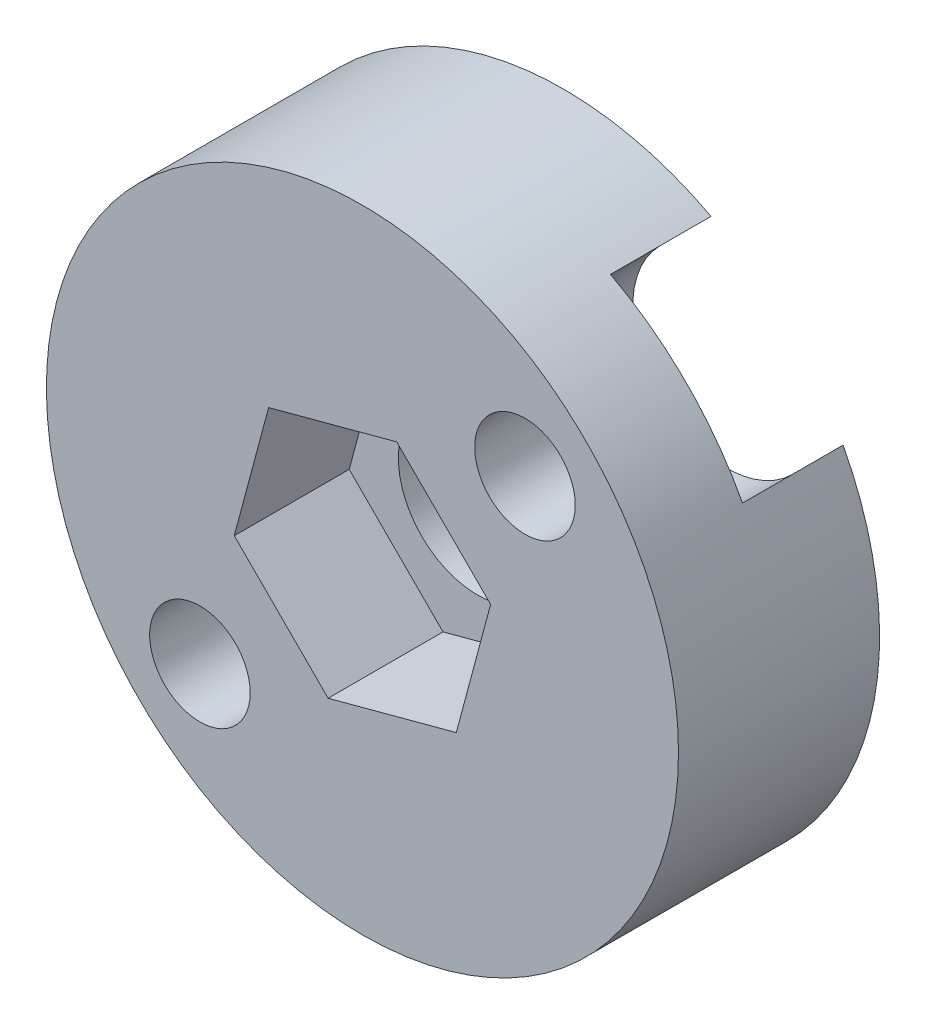
ISO-10303-21;
HEADER;
FILE_DESCRIPTION(('STEP AP214'),'2;1');
FILE_NAME('part.step','',(''),(''),'','','');
FILE_SCHEMA(('AUTOMOTIVE_DESIGN { 1 0 10303 214 1 1 1 1 }'));
ENDSEC;
DATA;
#1=APPLICATION_CONTEXT('core data for automotive mechanical design processes');
#2=APPLICATION_PROTOCOL_DEFINITION('international standard','automotive_design',2000,#1);
#3=PRODUCT_CONTEXT('',#1,'mechanical');
#4=PRODUCT('Part','Part','',(#3));
#5=PRODUCT_RELATED_PRODUCT_CATEGORY('part','',(#4));
#6=PRODUCT_DEFINITION_FORMATION('','',#4);
#7=PRODUCT_DEFINITION_CONTEXT('part definition',#1,'design');
#8=PRODUCT_DEFINITION('design','',#6,#7);
#9=PRODUCT_DEFINITION_SHAPE('','',#8);
#10=(LENGTH_UNIT() NAMED_UNIT(*) SI_UNIT(.MILLI.,.METRE.));
#11=(NAMED_UNIT(*) PLANE_ANGLE_UNIT() SI_UNIT($,.RADIAN.));
#12=(NAMED_UNIT(*) SI_UNIT($,.STERADIAN.) SOLID_ANGLE_UNIT());
#13=UNCERTAINTY_MEASURE_WITH_UNIT(LENGTH_MEASURE(1.E-05),#10,'distance_accuracy_value','');
#14=(GEOMETRIC_REPRESENTATION_CONTEXT(3) GLOBAL_UNCERTAINTY_ASSIGNED_CONTEXT((#13)) GLOBAL_UNIT_ASSIGNED_CONTEXT((#10,
#11,#12)) REPRESENTATION_CONTEXT('',''));
#15=CARTESIAN_POINT('',(0.,0.,0.));
#16=DIRECTION('',(0.,0.,1.));
#17=DIRECTION('',(1.,0.,0.));
#18=AXIS2_PLACEMENT_3D('',#15,#16,#17);
#19=CARTESIAN_POINT('',(0.,0.,7.));
#20=DIRECTION('',(0.,0.,-1.));
#21=DIRECTION('',(-1.,0.,0.));
#22=AXIS2_PLACEMENT_3D('',#19,#20,#21);
#23=CYLINDRICAL_SURFACE('',#22,2.75);
#24=CARTESIAN_POINT('',(0.,0.,0.));
#25=DIRECTION('',(0.,0.,1.));
#26=DIRECTION('',(1.,0.,0.));
#27=AXIS2_PLACEMENT_3D('',#24,#25,#26);
#28=CIRCLE('',#27,2.75);
#29=CARTESIAN_POINT('',(2.75,0.,0.));
#30=VERTEX_POINT('',#29);
#31=EDGE_CURVE('E244',#30,#30,#28,.T.);
#32=ORIENTED_EDGE('',*,*,#31,.F.);
#33=EDGE_LOOP('',(#32));
#34=FACE_BOUND('',#33,.T.);
#35=CARTESIAN_POINT('',(0.,0.,3.));
#36=DIRECTION('',(0.,0.,1.));
#37=DIRECTION('',(1.,0.,0.));
#38=AXIS2_PLACEMENT_3D('',#35,#36,#37);
#39=CIRCLE('',#38,2.75);
#40=CARTESIAN_POINT('',(2.75,0.,3.));
#41=VERTEX_POINT('',#40);
#42=EDGE_CURVE('E38',#41,#41,#39,.T.);
#43=ORIENTED_EDGE('',*,*,#42,.T.);
#44=EDGE_LOOP('',(#43));
#45=FACE_BOUND('',#44,.T.);
#46=ADVANCED_FACE('F34',(#34,#45),#23,.F.);
#47=CARTESIAN_POINT('',(0.,0.,7.));
#48=DIRECTION('',(0.,0.,1.));
#49=DIRECTION('',(1.,0.,0.));
#50=AXIS2_PLACEMENT_3D('',#47,#48,#49);
#51=PLANE('',#50);
#52=DIRECTION('',(0.707106781186547,-0.707106781186548,0.));
#53=VECTOR('',#52,1.);
#54=CARTESIAN_POINT('',(-4.46142028660164,-1.19543396289074,7.));
#55=LINE('',#54,#53);
#56=CARTESIAN_POINT('',(-4.46142028660164,-1.19543396289074,7.));
#57=VERTEX_POINT('',#56);
#58=CARTESIAN_POINT('',(-1.19543396289074,-4.46142028660164,7.));
#59=VERTEX_POINT('',#58);
#60=EDGE_CURVE('E196',#57,#59,#55,.T.);
#61=ORIENTED_EDGE('',*,*,#60,.F.);
#62=DIRECTION('',(-0.258819045102521,-0.965925826289068,0.));
#63=VECTOR('',#62,1.);
#64=CARTESIAN_POINT('',(-3.2659863237109,3.26598632371091,7.));
#65=LINE('',#64,#63);
#66=CARTESIAN_POINT('',(-3.2659863237109,3.26598632371091,7.));
#67=VERTEX_POINT('',#66);
#68=EDGE_CURVE('E201',#67,#57,#65,.T.);
#69=ORIENTED_EDGE('',*,*,#68,.F.);
#70=DIRECTION('',(-0.965925826289068,-0.258819045102521,0.));
#71=VECTOR('',#70,1.);
#72=CARTESIAN_POINT('',(1.19543396289074,4.46142028660164,7.));
#73=LINE('',#72,#71);
#74=CARTESIAN_POINT('',(1.19543396289074,4.46142028660164,7.));
#75=VERTEX_POINT('',#74);
#76=EDGE_CURVE('E227',#75,#67,#73,.T.);
#77=ORIENTED_EDGE('',*,*,#76,.F.);
#78=DIRECTION('',(-0.707106781186547,0.707106781186547,0.));
#79=VECTOR('',#78,1.);
#80=CARTESIAN_POINT('',(4.46142028660164,1.19543396289074,7.));
#81=LINE('',#80,#79);
#82=CARTESIAN_POINT('',(4.46142028660164,1.19543396289074,7.));
#83=VERTEX_POINT('',#82);
#84=EDGE_CURVE('E224',#83,#75,#81,.T.);
#85=ORIENTED_EDGE('',*,*,#84,.F.);
#86=DIRECTION('',(0.25881904510252,0.965925826289068,0.));
#87=VECTOR('',#86,1.);
#88=CARTESIAN_POINT('',(3.2659863237109,-3.26598632371091,7.));
#89=LINE('',#88,#87);
#90=CARTESIAN_POINT('',(3.2659863237109,-3.26598632371091,7.));
#91=VERTEX_POINT('',#90);
#92=EDGE_CURVE('E221',#91,#83,#89,.T.);
#93=ORIENTED_EDGE('',*,*,#92,.F.);
#94=DIRECTION('',(0.965925826289068,0.258819045102521,0.));
#95=VECTOR('',#94,1.);
#96=CARTESIAN_POINT('',(-1.19543396289074,-4.46142028660164,7.));
#97=LINE('',#96,#95);
#98=EDGE_CURVE('E218',#59,#91,#97,.T.);
#99=ORIENTED_EDGE('',*,*,#98,.F.);
#100=EDGE_LOOP('',(#61,#69,#77,#85,#93,#99));
#101=FACE_BOUND('',#100,.T.);
#102=CARTESIAN_POINT('',(-5.65685424949238,-5.65685424949238,7.));
#103=DIRECTION('',(0.,0.,1.));
#104=DIRECTION('',(1.,0.,0.));
#105=AXIS2_PLACEMENT_3D('',#102,#103,#104);
#106=CIRCLE('',#105,1.75);
#107=CARTESIAN_POINT('',(-3.90685424949238,-5.65685424949238,7.));
#108=VERTEX_POINT('',#107);
#109=EDGE_CURVE('E247',#108,#108,#106,.T.);
#110=ORIENTED_EDGE('',*,*,#109,.F.);
#111=EDGE_LOOP('',(#110));
#112=FACE_BOUND('',#111,.T.);
#113=CARTESIAN_POINT('',(0.,0.,7.));
#114=DIRECTION('',(0.,0.,1.));
#115=DIRECTION('',(1.,0.,0.));
#116=AXIS2_PLACEMENT_3D('',#113,#114,#115);
#117=CIRCLE('',#116,11.);
#118=CARTESIAN_POINT('',(11.,0.,7.));
#119=VERTEX_POINT('',#118);
#120=EDGE_CURVE('E12',#119,#119,#117,.T.);
#121=ORIENTED_EDGE('',*,*,#120,.T.);
#122=EDGE_LOOP('',(#121));
#123=FACE_BOUND('',#122,.T.);
#124=CARTESIAN_POINT('',(5.65685424949238,5.65685424949238,7.));
#125=DIRECTION('',(0.,0.,1.));
#126=DIRECTION('',(1.,0.,0.));
#127=AXIS2_PLACEMENT_3D('',#124,#125,#126);
#128=CIRCLE('',#127,1.75);
#129=CARTESIAN_POINT('',(7.40685424949238,5.65685424949238,7.));
#130=VERTEX_POINT('',#129);
#131=EDGE_CURVE('E250',#130,#130,#128,.T.);
#132=ORIENTED_EDGE('',*,*,#131,.F.);
#133=EDGE_LOOP('',(#132));
#134=FACE_BOUND('',#133,.T.);
#135=ADVANCED_FACE('F295',(#101,#112,#123,#134),#51,.T.);
#136=CARTESIAN_POINT('',(0.,0.,0.));
#137=DIRECTION('',(0.,0.,1.));
#138=DIRECTION('',(1.,0.,0.));
#139=AXIS2_PLACEMENT_3D('',#136,#137,#138);
#140=PLANE('',#139);
#141=CARTESIAN_POINT('',(0.,0.,0.));
#142=DIRECTION('',(0.,0.,1.));
#143=DIRECTION('',(1.,0.,0.));
#144=AXIS2_PLACEMENT_3D('',#141,#142,#143);
#145=CIRCLE('',#144,11.);
#146=CARTESIAN_POINT('',(-5.13283493499465,-9.72902901270721,0.));
#147=VERTEX_POINT('',#146);
#148=CARTESIAN_POINT('',(9.7290290127072,5.13283493499465,0.));
#149=VERTEX_POINT('',#148);
#150=EDGE_CURVE('E252',#147,#149,#145,.T.);
#151=ORIENTED_EDGE('',*,*,#150,.F.);
#152=DIRECTION('',(-0.707106781186548,-0.707106781186548,0.));
#153=VECTOR('',#152,1.);
#154=CARTESIAN_POINT('',(2.29809703885628,-2.29809703885628,0.));
#155=LINE('',#154,#153);
#156=CARTESIAN_POINT('',(-3.3587572106361,-7.95495128834866,0.));
#157=VERTEX_POINT('',#156);
#158=EDGE_CURVE('E160',#157,#147,#155,.T.);
#159=ORIENTED_EDGE('',*,*,#158,.F.);
#160=CARTESIAN_POINT('',(-5.65685424949238,-5.65685424949238,0.));
#161=DIRECTION('',(0.,0.,-1.));
#162=DIRECTION('',(1.,0.,0.));
#163=AXIS2_PLACEMENT_3D('',#160,#161,#162);
#164=CIRCLE('',#163,3.25);
#165=CARTESIAN_POINT('',(-7.95495128834866,-3.3587572106361,0.));
#166=VERTEX_POINT('',#165);
#167=EDGE_CURVE('E164',#166,#157,#164,.T.);
#168=ORIENTED_EDGE('',*,*,#167,.F.);
#169=DIRECTION('',(-0.707106781186547,-0.707106781186548,0.));
#170=VECTOR('',#169,1.);
#171=CARTESIAN_POINT('',(-2.29809703885628,2.29809703885628,0.));
#172=LINE('',#171,#170);
#173=CARTESIAN_POINT('',(-9.7290290127072,-5.13283493499465,0.));
#174=VERTEX_POINT('',#173);
#175=EDGE_CURVE('E158',#166,#174,#172,.T.);
#176=ORIENTED_EDGE('',*,*,#175,.T.);
#177=CARTESIAN_POINT('',(5.13283493499465,9.72902901270721,0.));
#178=VERTEX_POINT('',#177);
#179=EDGE_CURVE('E43',#178,#174,#145,.T.);
#180=ORIENTED_EDGE('',*,*,#179,.F.);
#181=DIRECTION('',(0.707106781186548,0.707106781186548,0.));
#182=VECTOR('',#181,1.);
#183=CARTESIAN_POINT('',(-2.29809703885628,2.29809703885628,0.));
#184=LINE('',#183,#182);
#185=CARTESIAN_POINT('',(3.3587572106361,7.95495128834866,0.));
#186=VERTEX_POINT('',#185);
#187=EDGE_CURVE('E182',#186,#178,#184,.T.);
#188=ORIENTED_EDGE('',*,*,#187,.F.);
#189=CARTESIAN_POINT('',(5.65685424949238,5.65685424949238,0.));
#190=DIRECTION('',(0.,0.,-1.));
#191=DIRECTION('',(-1.,0.,0.));
#192=AXIS2_PLACEMENT_3D('',#189,#190,#191);
#193=CIRCLE('',#192,3.25);
#194=CARTESIAN_POINT('',(7.95495128834866,3.3587572106361,0.));
#195=VERTEX_POINT('',#194);
#196=EDGE_CURVE('E179',#195,#186,#193,.T.);
#197=ORIENTED_EDGE('',*,*,#196,.F.);
#198=DIRECTION('',(0.707106781186547,0.707106781186548,0.));
#199=VECTOR('',#198,1.);
#200=CARTESIAN_POINT('',(2.29809703885628,-2.29809703885628,0.));
#201=LINE('',#200,#199);
#202=EDGE_CURVE('E176',#195,#149,#201,.T.);
#203=ORIENTED_EDGE('',*,*,#202,.T.);
#204=EDGE_LOOP('',(#151,#159,#168,#176,#180,#188,#197,#203));
#205=FACE_BOUND('',#204,.T.);
#206=ORIENTED_EDGE('',*,*,#31,.T.);
#207=EDGE_LOOP('',(#206));
#208=FACE_BOUND('',#207,.T.);
#209=ADVANCED_FACE('F269',(#205,#208),#140,.F.);
#210=CARTESIAN_POINT('',(0.,0.,7.));
#211=DIRECTION('',(0.,0.,-1.));
#212=DIRECTION('',(-1.,0.,0.));
#213=AXIS2_PLACEMENT_3D('',#210,#211,#212);
#214=CYLINDRICAL_SURFACE('',#213,11.);
#215=CARTESIAN_POINT('',(0.,0.,3.5));
#216=DIRECTION('',(0.,0.,1.));
#217=DIRECTION('',(1.,0.,0.));
#218=AXIS2_PLACEMENT_3D('',#215,#216,#217);
#219=CIRCLE('',#218,11.);
#220=CARTESIAN_POINT('',(-5.13283493499464,-9.7290290127072,3.5));
#221=VERTEX_POINT('',#220);
#222=CARTESIAN_POINT('',(-9.7290290127072,-5.13283493499465,3.5));
#223=VERTEX_POINT('',#222);
#224=EDGE_CURVE('E151',#221,#223,#219,.F.);
#225=ORIENTED_EDGE('',*,*,#224,.F.);
#226=DIRECTION('',(0.,0.,-1.));
#227=VECTOR('',#226,1.);
#228=CARTESIAN_POINT('',(-5.13283493499465,-9.72902901270721,17.3551188562044));
#229=LINE('',#228,#227);
#230=EDGE_CURVE('E162',#221,#147,#229,.T.);
#231=ORIENTED_EDGE('',*,*,#230,.T.);
#232=ORIENTED_EDGE('',*,*,#150,.T.);
#233=DIRECTION('',(0.,0.,-1.));
#234=VECTOR('',#233,1.);
#235=CARTESIAN_POINT('',(9.7290290127072,5.13283493499465,17.3551188562044));
#236=LINE('',#235,#234);
#237=CARTESIAN_POINT('',(9.7290290127072,5.13283493499465,3.5));
#238=VERTEX_POINT('',#237);
#239=EDGE_CURVE('E185',#238,#149,#236,.T.);
#240=ORIENTED_EDGE('',*,*,#239,.F.);
#241=CARTESIAN_POINT('',(0.,0.,3.5));
#242=DIRECTION('',(0.,0.,1.));
#243=DIRECTION('',(1.,0.,0.));
#244=AXIS2_PLACEMENT_3D('',#241,#242,#243);
#245=CIRCLE('',#244,11.);
#246=CARTESIAN_POINT('',(5.13283493499464,9.7290290127072,3.5));
#247=VERTEX_POINT('',#246);
#248=EDGE_CURVE('E169',#247,#238,#245,.F.);
#249=ORIENTED_EDGE('',*,*,#248,.F.);
#250=DIRECTION('',(0.,0.,-1.));
#251=VECTOR('',#250,1.);
#252=CARTESIAN_POINT('',(5.13283493499465,9.72902901270721,17.3551188562044));
#253=LINE('',#252,#251);
#254=EDGE_CURVE('E189',#247,#178,#253,.T.);
#255=ORIENTED_EDGE('',*,*,#254,.T.);
#256=ORIENTED_EDGE('',*,*,#179,.T.);
#257=DIRECTION('',(0.,0.,-1.));
#258=VECTOR('',#257,1.);
#259=CARTESIAN_POINT('',(-9.7290290127072,-5.13283493499465,17.3551188562044));
#260=LINE('',#259,#258);
#261=EDGE_CURVE('E146',#223,#174,#260,.T.);
#262=ORIENTED_EDGE('',*,*,#261,.F.);
#263=EDGE_LOOP('',(#225,#231,#232,#240,#249,#255,#256,#262));
#264=FACE_BOUND('',#263,.T.);
#265=ORIENTED_EDGE('',*,*,#120,.F.);
#266=EDGE_LOOP('',(#265));
#267=FACE_BOUND('',#266,.T.);
#268=ADVANCED_FACE('F36',(#264,#267),#214,.T.);
#269=CARTESIAN_POINT('',(5.65685424949238,5.65685424949238,7.));
#270=DIRECTION('',(0.,0.,-1.));
#271=DIRECTION('',(-1.,0.,0.));
#272=AXIS2_PLACEMENT_3D('',#269,#270,#271);
#273=CYLINDRICAL_SURFACE('',#272,1.75);
#274=CARTESIAN_POINT('',(5.65685424949238,5.65685424949238,3.5));
#275=DIRECTION('',(0.,0.,1.));
#276=DIRECTION('',(1.,0.,0.));
#277=AXIS2_PLACEMENT_3D('',#274,#275,#276);
#278=CIRCLE('',#277,1.75);
#279=CARTESIAN_POINT('',(7.40685424949238,5.65685424949238,3.5));
#280=VERTEX_POINT('',#279);
#281=EDGE_CURVE('E173',#280,#280,#278,.T.);
#282=ORIENTED_EDGE('',*,*,#281,.F.);
#283=EDGE_LOOP('',(#282));
#284=FACE_BOUND('',#283,.T.);
#285=ORIENTED_EDGE('',*,*,#131,.T.);
#286=EDGE_LOOP('',(#285));
#287=FACE_BOUND('',#286,.T.);
#288=ADVANCED_FACE('F291',(#284,#287),#273,.F.);
#289=CARTESIAN_POINT('',(-5.65685424949238,-5.65685424949238,7.));
#290=DIRECTION('',(0.,0.,-1.));
#291=DIRECTION('',(-1.,0.,0.));
#292=AXIS2_PLACEMENT_3D('',#289,#290,#291);
#293=CYLINDRICAL_SURFACE('',#292,1.75);
#294=CARTESIAN_POINT('',(-5.65685424949238,-5.65685424949238,3.5));
#295=DIRECTION('',(0.,0.,1.));
#296=DIRECTION('',(1.,0.,0.));
#297=AXIS2_PLACEMENT_3D('',#294,#295,#296);
#298=CIRCLE('',#297,1.75);
#299=CARTESIAN_POINT('',(-3.90685424949238,-5.65685424949238,3.5));
#300=VERTEX_POINT('',#299);
#301=EDGE_CURVE('E154',#300,#300,#298,.T.);
#302=ORIENTED_EDGE('',*,*,#301,.F.);
#303=EDGE_LOOP('',(#302));
#304=FACE_BOUND('',#303,.T.);
#305=ORIENTED_EDGE('',*,*,#109,.T.);
#306=EDGE_LOOP('',(#305));
#307=FACE_BOUND('',#306,.T.);
#308=ADVANCED_FACE('F287',(#304,#307),#293,.F.);
#309=CARTESIAN_POINT('',(-4.46142028660164,-1.19543396289074,3.));
#310=DIRECTION('',(-0.707106781186548,-0.707106781186547,0.));
#311=DIRECTION('',(0.707106781186547,-0.707106781186548,0.));
#312=AXIS2_PLACEMENT_3D('',#309,#310,#311);
#313=PLANE('',#312);
#314=ORIENTED_EDGE('',*,*,#60,.T.);
#315=DIRECTION('',(0.,0.,1.));
#316=VECTOR('',#315,1.);
#317=CARTESIAN_POINT('',(-1.19543396289074,-4.46142028660164,3.));
#318=LINE('',#317,#316);
#319=CARTESIAN_POINT('',(-1.19543396289074,-4.46142028660164,3.));
#320=VERTEX_POINT('',#319);
#321=EDGE_CURVE('E216',#320,#59,#318,.T.);
#322=ORIENTED_EDGE('',*,*,#321,.F.);
#323=DIRECTION('',(0.707106781186547,-0.707106781186548,0.));
#324=VECTOR('',#323,1.);
#325=CARTESIAN_POINT('',(-4.46142028660164,-1.19543396289074,3.));
#326=LINE('',#325,#324);
#327=CARTESIAN_POINT('',(-4.46142028660164,-1.19543396289074,3.));
#328=VERTEX_POINT('',#327);
#329=EDGE_CURVE('E197',#328,#320,#326,.T.);
#330=ORIENTED_EDGE('',*,*,#329,.F.);
#331=DIRECTION('',(0.,0.,1.));
#332=VECTOR('',#331,1.);
#333=CARTESIAN_POINT('',(-4.46142028660164,-1.19543396289074,3.));
#334=LINE('',#333,#332);
#335=EDGE_CURVE('E232',#328,#57,#334,.T.);
#336=ORIENTED_EDGE('',*,*,#335,.T.);
#337=EDGE_LOOP('',(#314,#322,#330,#336));
#338=FACE_BOUND('',#337,.T.);
#339=ADVANCED_FACE('F290',(#338),#313,.F.);
#340=CARTESIAN_POINT('',(-3.2659863237109,3.26598632371091,3.));
#341=DIRECTION('',(-0.965925826289068,0.258819045102521,0.));
#342=DIRECTION('',(-0.258819045102521,-0.965925826289068,0.));
#343=AXIS2_PLACEMENT_3D('',#340,#341,#342);
#344=PLANE('',#343);
#345=ORIENTED_EDGE('',*,*,#68,.T.);
#346=ORIENTED_EDGE('',*,*,#335,.F.);
#347=DIRECTION('',(-0.258819045102521,-0.965925826289068,0.));
#348=VECTOR('',#347,1.);
#349=CARTESIAN_POINT('',(-3.2659863237109,3.26598632371091,3.));
#350=LINE('',#349,#348);
#351=CARTESIAN_POINT('',(-3.2659863237109,3.26598632371091,3.));
#352=VERTEX_POINT('',#351);
#353=EDGE_CURVE('E213',#352,#328,#350,.T.);
#354=ORIENTED_EDGE('',*,*,#353,.F.);
#355=DIRECTION('',(0.,0.,1.));
#356=VECTOR('',#355,1.);
#357=CARTESIAN_POINT('',(-3.2659863237109,3.26598632371091,3.));
#358=LINE('',#357,#356);
#359=EDGE_CURVE('E234',#352,#67,#358,.T.);
#360=ORIENTED_EDGE('',*,*,#359,.T.);
#361=EDGE_LOOP('',(#345,#346,#354,#360));
#362=FACE_BOUND('',#361,.T.);
#363=ADVANCED_FACE('F321',(#362),#344,.F.);
#364=CARTESIAN_POINT('',(1.19543396289074,4.46142028660164,3.));
#365=DIRECTION('',(-0.258819045102521,0.965925826289068,0.));
#366=DIRECTION('',(-0.965925826289068,-0.258819045102521,0.));
#367=AXIS2_PLACEMENT_3D('',#364,#365,#366);
#368=PLANE('',#367);
#369=ORIENTED_EDGE('',*,*,#76,.T.);
#370=ORIENTED_EDGE('',*,*,#359,.F.);
#371=DIRECTION('',(-0.965925826289068,-0.258819045102521,0.));
#372=VECTOR('',#371,1.);
#373=CARTESIAN_POINT('',(1.19543396289074,4.46142028660164,3.));
#374=LINE('',#373,#372);
#375=CARTESIAN_POINT('',(1.19543396289074,4.46142028660164,3.));
#376=VERTEX_POINT('',#375);
#377=EDGE_CURVE('E210',#376,#352,#374,.T.);
#378=ORIENTED_EDGE('',*,*,#377,.F.);
#379=DIRECTION('',(0.,0.,1.));
#380=VECTOR('',#379,1.);
#381=CARTESIAN_POINT('',(1.19543396289074,4.46142028660164,3.));
#382=LINE('',#381,#380);
#383=EDGE_CURVE('E236',#376,#75,#382,.T.);
#384=ORIENTED_EDGE('',*,*,#383,.T.);
#385=EDGE_LOOP('',(#369,#370,#378,#384));
#386=FACE_BOUND('',#385,.T.);
#387=ADVANCED_FACE('F335',(#386),#368,.F.);
#388=CARTESIAN_POINT('',(4.46142028660164,1.19543396289074,3.));
#389=DIRECTION('',(0.707106781186547,0.707106781186547,0.));
#390=DIRECTION('',(-0.707106781186548,0.707106781186548,0.));
#391=AXIS2_PLACEMENT_3D('',#388,#389,#390);
#392=PLANE('',#391);
#393=ORIENTED_EDGE('',*,*,#84,.T.);
#394=ORIENTED_EDGE('',*,*,#383,.F.);
#395=DIRECTION('',(-0.707106781186547,0.707106781186547,0.));
#396=VECTOR('',#395,1.);
#397=CARTESIAN_POINT('',(4.46142028660164,1.19543396289074,3.));
#398=LINE('',#397,#396);
#399=CARTESIAN_POINT('',(4.46142028660164,1.19543396289074,3.));
#400=VERTEX_POINT('',#399);
#401=EDGE_CURVE('E207',#400,#376,#398,.T.);
#402=ORIENTED_EDGE('',*,*,#401,.F.);
#403=DIRECTION('',(0.,0.,1.));
#404=VECTOR('',#403,1.);
#405=CARTESIAN_POINT('',(4.46142028660164,1.19543396289074,3.));
#406=LINE('',#405,#404);
#407=EDGE_CURVE('E238',#400,#83,#406,.T.);
#408=ORIENTED_EDGE('',*,*,#407,.T.);
#409=EDGE_LOOP('',(#393,#394,#402,#408));
#410=FACE_BOUND('',#409,.T.);
#411=ADVANCED_FACE('F331',(#410),#392,.F.);
#412=CARTESIAN_POINT('',(3.2659863237109,-3.26598632371091,3.));
#413=DIRECTION('',(0.965925826289068,-0.258819045102521,0.));
#414=DIRECTION('',(0.258819045102521,0.965925826289068,0.));
#415=AXIS2_PLACEMENT_3D('',#412,#413,#414);
#416=PLANE('',#415);
#417=ORIENTED_EDGE('',*,*,#92,.T.);
#418=ORIENTED_EDGE('',*,*,#407,.F.);
#419=DIRECTION('',(0.25881904510252,0.965925826289068,0.));
#420=VECTOR('',#419,1.);
#421=CARTESIAN_POINT('',(3.2659863237109,-3.26598632371091,3.));
#422=LINE('',#421,#420);
#423=CARTESIAN_POINT('',(3.2659863237109,-3.26598632371091,3.));
#424=VERTEX_POINT('',#423);
#425=EDGE_CURVE('E204',#424,#400,#422,.T.);
#426=ORIENTED_EDGE('',*,*,#425,.F.);
#427=DIRECTION('',(0.,0.,1.));
#428=VECTOR('',#427,1.);
#429=CARTESIAN_POINT('',(3.2659863237109,-3.26598632371091,3.));
#430=LINE('',#429,#428);
#431=EDGE_CURVE('E240',#424,#91,#430,.T.);
#432=ORIENTED_EDGE('',*,*,#431,.T.);
#433=EDGE_LOOP('',(#417,#418,#426,#432));
#434=FACE_BOUND('',#433,.T.);
#435=ADVANCED_FACE('F327',(#434),#416,.F.);
#436=CARTESIAN_POINT('',(-1.19543396289074,-4.46142028660164,3.));
#437=DIRECTION('',(0.25881904510252,-0.965925826289068,0.));
#438=DIRECTION('',(0.965925826289069,0.258819045102521,0.));
#439=AXIS2_PLACEMENT_3D('',#436,#437,#438);
#440=PLANE('',#439);
#441=ORIENTED_EDGE('',*,*,#98,.T.);
#442=ORIENTED_EDGE('',*,*,#431,.F.);
#443=DIRECTION('',(0.965925826289068,0.258819045102521,0.));
#444=VECTOR('',#443,1.);
#445=CARTESIAN_POINT('',(-1.19543396289074,-4.46142028660164,3.));
#446=LINE('',#445,#444);
#447=EDGE_CURVE('E200',#320,#424,#446,.T.);
#448=ORIENTED_EDGE('',*,*,#447,.F.);
#449=ORIENTED_EDGE('',*,*,#321,.T.);
#450=EDGE_LOOP('',(#441,#442,#448,#449));
#451=FACE_BOUND('',#450,.T.);
#452=ADVANCED_FACE('F323',(#451),#440,.F.);
#453=CARTESIAN_POINT('',(0.,0.,3.));
#454=DIRECTION('',(0.,0.,1.));
#455=DIRECTION('',(1.,0.,0.));
#456=AXIS2_PLACEMENT_3D('',#453,#454,#455);
#457=PLANE('',#456);
#458=ORIENTED_EDGE('',*,*,#42,.F.);
#459=EDGE_LOOP('',(#458));
#460=FACE_BOUND('',#459,.T.);
#461=ORIENTED_EDGE('',*,*,#329,.T.);
#462=ORIENTED_EDGE('',*,*,#447,.T.);
#463=ORIENTED_EDGE('',*,*,#425,.T.);
#464=ORIENTED_EDGE('',*,*,#401,.T.);
#465=ORIENTED_EDGE('',*,*,#377,.T.);
#466=ORIENTED_EDGE('',*,*,#353,.T.);
#467=EDGE_LOOP('',(#461,#462,#463,#464,#465,#466));
#468=FACE_BOUND('',#467,.T.);
#469=ADVANCED_FACE('F326',(#460,#468),#457,.T.);
#470=CARTESIAN_POINT('',(5.65685424949238,5.65685424949238,17.3551188562044));
#471=DIRECTION('',(0.,0.,-1.));
#472=DIRECTION('',(-1.,0.,0.));
#473=AXIS2_PLACEMENT_3D('',#470,#471,#472);
#474=CYLINDRICAL_SURFACE('',#473,3.25);
#475=DIRECTION('',(0.,0.,-1.));
#476=VECTOR('',#475,1.);
#477=CARTESIAN_POINT('',(7.95495128834866,3.3587572106361,17.3551188562044));
#478=LINE('',#477,#476);
#479=CARTESIAN_POINT('',(7.95495128834866,3.3587572106361,3.5));
#480=VERTEX_POINT('',#479);
#481=EDGE_CURVE('E184',#480,#195,#478,.T.);
#482=ORIENTED_EDGE('',*,*,#481,.T.);
#483=ORIENTED_EDGE('',*,*,#196,.T.);
#484=DIRECTION('',(0.,0.,-1.));
#485=VECTOR('',#484,1.);
#486=CARTESIAN_POINT('',(3.3587572106361,7.95495128834866,17.3551188562044));
#487=LINE('',#486,#485);
#488=CARTESIAN_POINT('',(3.3587572106361,7.95495128834866,3.5));
#489=VERTEX_POINT('',#488);
#490=EDGE_CURVE('E192',#489,#186,#487,.T.);
#491=ORIENTED_EDGE('',*,*,#490,.F.);
#492=CARTESIAN_POINT('',(5.65685424949238,5.65685424949238,3.5));
#493=DIRECTION('',(0.,0.,1.));
#494=DIRECTION('',(1.,0.,0.));
#495=AXIS2_PLACEMENT_3D('',#492,#493,#494);
#496=CIRCLE('',#495,3.25);
#497=EDGE_CURVE('E188',#480,#489,#496,.F.);
#498=ORIENTED_EDGE('',*,*,#497,.F.);
#499=EDGE_LOOP('',(#482,#483,#491,#498));
#500=FACE_BOUND('',#499,.T.);
#501=ADVANCED_FACE('F274',(#500),#474,.F.);
#502=CARTESIAN_POINT('',(-2.29809703885628,2.29809703885628,17.3551188562044));
#503=DIRECTION('',(-0.707106781186547,0.707106781186547,0.));
#504=DIRECTION('',(-0.707106781186548,-0.707106781186548,0.));
#505=AXIS2_PLACEMENT_3D('',#502,#503,#504);
#506=PLANE('',#505);
#507=ORIENTED_EDGE('',*,*,#490,.T.);
#508=ORIENTED_EDGE('',*,*,#187,.T.);
#509=ORIENTED_EDGE('',*,*,#254,.F.);
#510=DIRECTION('',(0.707106781186548,0.707106781186548,0.));
#511=VECTOR('',#510,1.);
#512=CARTESIAN_POINT('',(-2.29809703885628,2.29809703885628,3.5));
#513=LINE('',#512,#511);
#514=EDGE_CURVE('E59',#489,#247,#513,.T.);
#515=ORIENTED_EDGE('',*,*,#514,.F.);
#516=EDGE_LOOP('',(#507,#508,#509,#515));
#517=FACE_BOUND('',#516,.T.);
#518=ADVANCED_FACE('F348',(#517),#506,.F.);
#519=CARTESIAN_POINT('',(2.29809703885628,-2.29809703885628,17.3551188562044));
#520=DIRECTION('',(-0.707106781186548,0.707106781186547,0.));
#521=DIRECTION('',(-0.707106781186547,-0.707106781186548,0.));
#522=AXIS2_PLACEMENT_3D('',#519,#520,#521);
#523=PLANE('',#522);
#524=DIRECTION('',(0.707106781186547,0.707106781186548,0.));
#525=VECTOR('',#524,1.);
#526=CARTESIAN_POINT('',(2.29809703885628,-2.29809703885628,3.5));
#527=LINE('',#526,#525);
#528=EDGE_CURVE('E171',#480,#238,#527,.T.);
#529=ORIENTED_EDGE('',*,*,#528,.T.);
#530=ORIENTED_EDGE('',*,*,#239,.T.);
#531=ORIENTED_EDGE('',*,*,#202,.F.);
#532=ORIENTED_EDGE('',*,*,#481,.F.);
#533=EDGE_LOOP('',(#529,#530,#531,#532));
#534=FACE_BOUND('',#533,.T.);
#535=ADVANCED_FACE('F265',(#534),#523,.T.);
#536=CARTESIAN_POINT('',(0.,0.,3.5));
#537=DIRECTION('',(0.,0.,1.));
#538=DIRECTION('',(1.,0.,0.));
#539=AXIS2_PLACEMENT_3D('',#536,#537,#538);
#540=PLANE('',#539);
#541=ORIENTED_EDGE('',*,*,#281,.T.);
#542=EDGE_LOOP('',(#541));
#543=FACE_BOUND('',#542,.T.);
#544=ORIENTED_EDGE('',*,*,#497,.T.);
#545=ORIENTED_EDGE('',*,*,#514,.T.);
#546=ORIENTED_EDGE('',*,*,#248,.T.);
#547=ORIENTED_EDGE('',*,*,#528,.F.);
#548=EDGE_LOOP('',(#544,#545,#546,#547));
#549=FACE_BOUND('',#548,.T.);
#550=ADVANCED_FACE('F275',(#543,#549),#540,.F.);
#551=CARTESIAN_POINT('',(-5.65685424949238,-5.65685424949238,17.3551188562044));
#552=DIRECTION('',(0.,0.,-1.));
#553=DIRECTION('',(-1.,0.,0.));
#554=AXIS2_PLACEMENT_3D('',#551,#552,#553);
#555=CYLINDRICAL_SURFACE('',#554,3.25);
#556=DIRECTION('',(0.,0.,-1.));
#557=VECTOR('',#556,1.);
#558=CARTESIAN_POINT('',(-7.95495128834866,-3.3587572106361,17.3551188562044));
#559=LINE('',#558,#557);
#560=CARTESIAN_POINT('',(-7.95495128834866,-3.3587572106361,3.5));
#561=VERTEX_POINT('',#560);
#562=EDGE_CURVE('E143',#561,#166,#559,.T.);
#563=ORIENTED_EDGE('',*,*,#562,.T.);
#564=ORIENTED_EDGE('',*,*,#167,.T.);
#565=DIRECTION('',(0.,0.,-1.));
#566=VECTOR('',#565,1.);
#567=CARTESIAN_POINT('',(-3.3587572106361,-7.95495128834866,17.3551188562044));
#568=LINE('',#567,#566);
#569=CARTESIAN_POINT('',(-3.3587572106361,-7.95495128834866,3.5));
#570=VERTEX_POINT('',#569);
#571=EDGE_CURVE('E145',#570,#157,#568,.T.);
#572=ORIENTED_EDGE('',*,*,#571,.F.);
#573=CARTESIAN_POINT('',(-5.65685424949238,-5.65685424949238,3.5));
#574=DIRECTION('',(0.,0.,1.));
#575=DIRECTION('',(1.,0.,0.));
#576=AXIS2_PLACEMENT_3D('',#573,#574,#575);
#577=CIRCLE('',#576,3.25);
#578=EDGE_CURVE('E138',#561,#570,#577,.F.);
#579=ORIENTED_EDGE('',*,*,#578,.F.);
#580=EDGE_LOOP('',(#563,#564,#572,#579));
#581=FACE_BOUND('',#580,.T.);
#582=ADVANCED_FACE('F140',(#581),#555,.F.);
#583=CARTESIAN_POINT('',(2.29809703885628,-2.29809703885628,17.3551188562044));
#584=DIRECTION('',(0.707106781186547,-0.707106781186547,0.));
#585=DIRECTION('',(0.707106781186548,0.707106781186548,0.));
#586=AXIS2_PLACEMENT_3D('',#583,#584,#585);
#587=PLANE('',#586);
#588=ORIENTED_EDGE('',*,*,#571,.T.);
#589=ORIENTED_EDGE('',*,*,#158,.T.);
#590=ORIENTED_EDGE('',*,*,#230,.F.);
#591=DIRECTION('',(-0.707106781186548,-0.707106781186548,0.));
#592=VECTOR('',#591,1.);
#593=CARTESIAN_POINT('',(2.29809703885628,-2.29809703885628,3.5));
#594=LINE('',#593,#592);
#595=EDGE_CURVE('E51',#570,#221,#594,.T.);
#596=ORIENTED_EDGE('',*,*,#595,.F.);
#597=EDGE_LOOP('',(#588,#589,#590,#596));
#598=FACE_BOUND('',#597,.T.);
#599=ADVANCED_FACE('F358',(#598),#587,.F.);
#600=CARTESIAN_POINT('',(-2.29809703885628,2.29809703885628,17.3551188562044));
#601=DIRECTION('',(0.707106781186548,-0.707106781186547,0.));
#602=DIRECTION('',(0.707106781186547,0.707106781186548,0.));
#603=AXIS2_PLACEMENT_3D('',#600,#601,#602);
#604=PLANE('',#603);
#605=DIRECTION('',(-0.707106781186547,-0.707106781186548,0.));
#606=VECTOR('',#605,1.);
#607=CARTESIAN_POINT('',(-2.29809703885628,2.29809703885628,3.5));
#608=LINE('',#607,#606);
#609=EDGE_CURVE('E148',#561,#223,#608,.T.);
#610=ORIENTED_EDGE('',*,*,#609,.T.);
#611=ORIENTED_EDGE('',*,*,#261,.T.);
#612=ORIENTED_EDGE('',*,*,#175,.F.);
#613=ORIENTED_EDGE('',*,*,#562,.F.);
#614=EDGE_LOOP('',(#610,#611,#612,#613));
#615=FACE_BOUND('',#614,.T.);
#616=ADVANCED_FACE('F156',(#615),#604,.T.);
#617=CARTESIAN_POINT('',(0.,0.,3.5));
#618=DIRECTION('',(0.,0.,1.));
#619=DIRECTION('',(1.,0.,0.));
#620=AXIS2_PLACEMENT_3D('',#617,#618,#619);
#621=PLANE('',#620);
#622=ORIENTED_EDGE('',*,*,#301,.T.);
#623=EDGE_LOOP('',(#622));
#624=FACE_BOUND('',#623,.T.);
#625=ORIENTED_EDGE('',*,*,#578,.T.);
#626=ORIENTED_EDGE('',*,*,#595,.T.);
#627=ORIENTED_EDGE('',*,*,#224,.T.);
#628=ORIENTED_EDGE('',*,*,#609,.F.);
#629=EDGE_LOOP('',(#625,#626,#627,#628));
#630=FACE_BOUND('',#629,.T.);
#631=ADVANCED_FACE('F149',(#624,#630),#621,.F.);
#632=CLOSED_SHELL('',(#46,#135,#209,#268,#288,#308,#339,#363,#387,#411,#435,#452,#469,#501,#518,
#535,#550,#582,#599,#616,#631));
#633=MANIFOLD_SOLID_BREP('B2',#632);
#634=ADVANCED_BREP_SHAPE_REPRESENTATION('',(#18,#633),#14);
#635=SHAPE_DEFINITION_REPRESENTATION(#9,#634);
ENDSEC;
END-ISO-10303-21;
